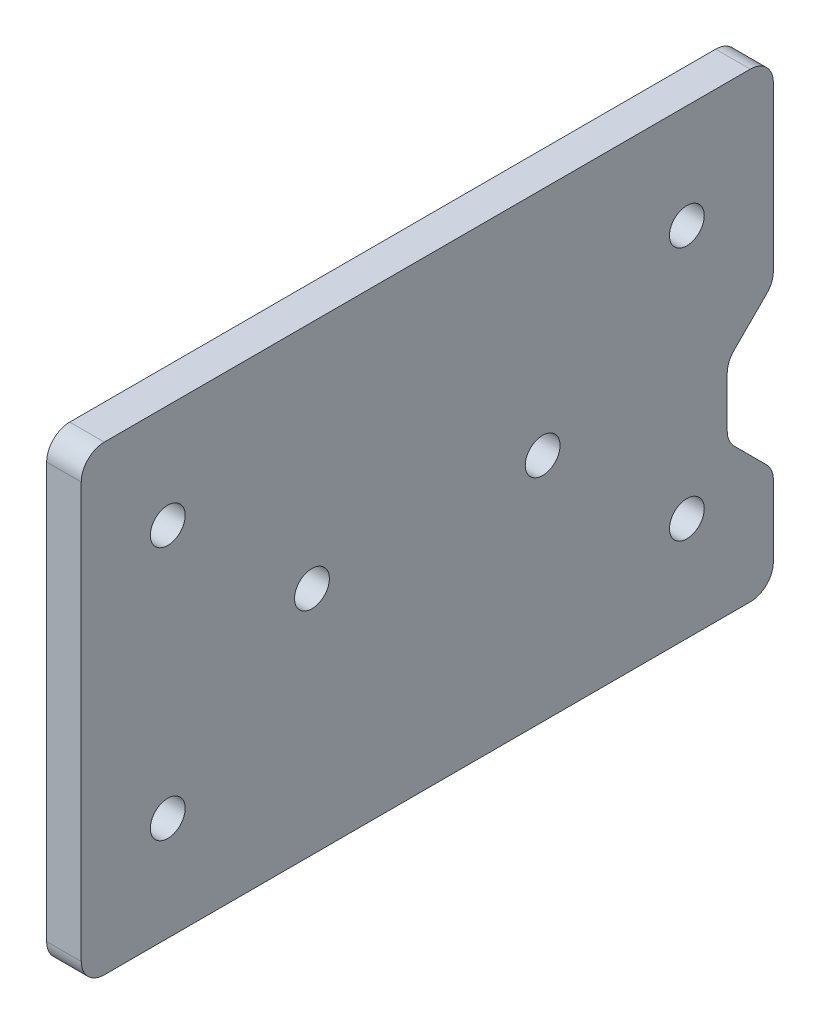
ISO-10303-21;
HEADER;
FILE_DESCRIPTION(('STEP AP214'),'2;1');
FILE_NAME('part.step','',(''),(''),'','','');
FILE_SCHEMA(('AUTOMOTIVE_DESIGN { 1 0 10303 214 1 1 1 1 }'));
ENDSEC;
DATA;
#1=APPLICATION_CONTEXT('core data for automotive mechanical design processes');
#2=APPLICATION_PROTOCOL_DEFINITION('international standard','automotive_design',2000,#1);
#3=PRODUCT_CONTEXT('',#1,'mechanical');
#4=PRODUCT('Part','Part','',(#3));
#5=PRODUCT_RELATED_PRODUCT_CATEGORY('part','',(#4));
#6=PRODUCT_DEFINITION_FORMATION('','',#4);
#7=PRODUCT_DEFINITION_CONTEXT('part definition',#1,'design');
#8=PRODUCT_DEFINITION('design','',#6,#7);
#9=PRODUCT_DEFINITION_SHAPE('','',#8);
#10=(LENGTH_UNIT() NAMED_UNIT(*) SI_UNIT(.MILLI.,.METRE.));
#11=(NAMED_UNIT(*) PLANE_ANGLE_UNIT() SI_UNIT($,.RADIAN.));
#12=(NAMED_UNIT(*) SI_UNIT($,.STERADIAN.) SOLID_ANGLE_UNIT());
#13=UNCERTAINTY_MEASURE_WITH_UNIT(LENGTH_MEASURE(1.E-05),#10,'distance_accuracy_value','');
#14=(GEOMETRIC_REPRESENTATION_CONTEXT(3) GLOBAL_UNCERTAINTY_ASSIGNED_CONTEXT((#13)) GLOBAL_UNIT_ASSIGNED_CONTEXT((#10,
#11,#12)) REPRESENTATION_CONTEXT('',''));
#15=CARTESIAN_POINT('',(0.,0.,0.));
#16=DIRECTION('',(0.,0.,1.));
#17=DIRECTION('',(1.,0.,0.));
#18=AXIS2_PLACEMENT_3D('',#15,#16,#17);
#19=CARTESIAN_POINT('',(3.,20.,-30.));
#20=DIRECTION('',(0.,0.,1.));
#21=DIRECTION('',(0.,-1.,0.));
#22=AXIS2_PLACEMENT_3D('',#19,#20,#21);
#23=PLANE('',#22);
#24=DIRECTION('',(0.,1.,0.));
#25=VECTOR('',#24,1.);
#26=CARTESIAN_POINT('',(3.,20.,-30.));
#27=LINE('',#26,#25);
#28=CARTESIAN_POINT('',(3.,3.8284271247462,-30.));
#29=VERTEX_POINT('',#28);
#30=CARTESIAN_POINT('',(3.,18.,-30.));
#31=VERTEX_POINT('',#30);
#32=EDGE_CURVE('E284',#29,#31,#27,.T.);
#33=ORIENTED_EDGE('',*,*,#32,.F.);
#34=DIRECTION('',(1.,0.,0.));
#35=VECTOR('',#34,1.);
#36=CARTESIAN_POINT('',(0.,3.8284271247462,-30.));
#37=LINE('',#36,#35);
#38=CARTESIAN_POINT('',(0.,3.8284271247462,-30.));
#39=VERTEX_POINT('',#38);
#40=EDGE_CURVE('E247',#29,#39,#37,.F.);
#41=ORIENTED_EDGE('',*,*,#40,.T.);
#42=DIRECTION('',(0.,1.,0.));
#43=VECTOR('',#42,1.);
#44=CARTESIAN_POINT('',(0.,20.,-30.));
#45=LINE('',#44,#43);
#46=CARTESIAN_POINT('',(0.,18.,-30.));
#47=VERTEX_POINT('',#46);
#48=EDGE_CURVE('E296',#39,#47,#45,.T.);
#49=ORIENTED_EDGE('',*,*,#48,.T.);
#50=DIRECTION('',(-1.,0.,0.));
#51=VECTOR('',#50,1.);
#52=CARTESIAN_POINT('',(3.,18.,-30.));
#53=LINE('',#52,#51);
#54=EDGE_CURVE('E250',#47,#31,#53,.F.);
#55=ORIENTED_EDGE('',*,*,#54,.T.);
#56=EDGE_LOOP('',(#33,#41,#49,#55));
#57=FACE_BOUND('',#56,.T.);
#58=ADVANCED_FACE('F42',(#57),#23,.F.);
#59=CARTESIAN_POINT('',(3.,-18.,-30.));
#60=VERTEX_POINT('',#59);
#61=CARTESIAN_POINT('',(3.,-11.8284271247462,-30.));
#62=VERTEX_POINT('',#61);
#63=EDGE_CURVE('E308',#60,#62,#27,.T.);
#64=ORIENTED_EDGE('',*,*,#63,.F.);
#65=DIRECTION('',(-1.,0.,0.));
#66=VECTOR('',#65,1.);
#67=CARTESIAN_POINT('',(3.,-18.,-30.));
#68=LINE('',#67,#66);
#69=CARTESIAN_POINT('',(0.,-18.,-30.));
#70=VERTEX_POINT('',#69);
#71=EDGE_CURVE('E204',#60,#70,#68,.T.);
#72=ORIENTED_EDGE('',*,*,#71,.T.);
#73=CARTESIAN_POINT('',(0.,-11.8284271247462,-30.));
#74=VERTEX_POINT('',#73);
#75=EDGE_CURVE('E292',#70,#74,#45,.T.);
#76=ORIENTED_EDGE('',*,*,#75,.T.);
#77=DIRECTION('',(1.,0.,0.));
#78=VECTOR('',#77,1.);
#79=CARTESIAN_POINT('',(3.,-11.8284271247462,-30.));
#80=LINE('',#79,#78);
#81=EDGE_CURVE('E208',#74,#62,#80,.T.);
#82=ORIENTED_EDGE('',*,*,#81,.T.);
#83=EDGE_LOOP('',(#64,#72,#76,#82));
#84=FACE_BOUND('',#83,.T.);
#85=ADVANCED_FACE('F391',(#84),#23,.F.);
#86=CARTESIAN_POINT('',(3.,0.,0.));
#87=DIRECTION('',(1.,0.,0.));
#88=DIRECTION('',(0.,0.,-1.));
#89=AXIS2_PLACEMENT_3D('',#86,#87,#88);
#90=PLANE('',#89);
#91=CARTESIAN_POINT('',(3.,0.,-9.99999999999999));
#92=DIRECTION('',(1.,0.,0.));
#93=DIRECTION('',(0.,0.,-1.));
#94=AXIS2_PLACEMENT_3D('',#91,#92,#93);
#95=CIRCLE('',#94,1.51);
#96=CARTESIAN_POINT('',(3.,0.,-11.51));
#97=VERTEX_POINT('',#96);
#98=EDGE_CURVE('E338',#97,#97,#95,.T.);
#99=ORIENTED_EDGE('',*,*,#98,.F.);
#100=EDGE_LOOP('',(#99));
#101=FACE_BOUND('',#100,.T.);
#102=CARTESIAN_POINT('',(3.,0.,10.));
#103=DIRECTION('',(1.,0.,0.));
#104=DIRECTION('',(0.,0.,-1.));
#105=AXIS2_PLACEMENT_3D('',#102,#103,#104);
#106=CIRCLE('',#105,1.51);
#107=CARTESIAN_POINT('',(3.,0.,8.49));
#108=VERTEX_POINT('',#107);
#109=EDGE_CURVE('E348',#108,#108,#106,.T.);
#110=ORIENTED_EDGE('',*,*,#109,.F.);
#111=EDGE_LOOP('',(#110));
#112=FACE_BOUND('',#111,.T.);
#113=CARTESIAN_POINT('',(3.,11.,-22.5));
#114=DIRECTION('',(1.,0.,0.));
#115=DIRECTION('',(0.,0.,-1.));
#116=AXIS2_PLACEMENT_3D('',#113,#114,#115);
#117=CIRCLE('',#116,1.51);
#118=CARTESIAN_POINT('',(3.,11.,-24.01));
#119=VERTEX_POINT('',#118);
#120=EDGE_CURVE('E312',#119,#119,#117,.T.);
#121=ORIENTED_EDGE('',*,*,#120,.F.);
#122=EDGE_LOOP('',(#121));
#123=FACE_BOUND('',#122,.T.);
#124=CARTESIAN_POINT('',(3.,11.,22.5));
#125=DIRECTION('',(1.,0.,0.));
#126=DIRECTION('',(0.,0.,-1.));
#127=AXIS2_PLACEMENT_3D('',#124,#125,#126);
#128=CIRCLE('',#127,1.51);
#129=CARTESIAN_POINT('',(3.,11.,20.99));
#130=VERTEX_POINT('',#129);
#131=EDGE_CURVE('E316',#130,#130,#128,.T.);
#132=ORIENTED_EDGE('',*,*,#131,.F.);
#133=EDGE_LOOP('',(#132));
#134=FACE_BOUND('',#133,.T.);
#135=CARTESIAN_POINT('',(3.,-11.,22.5));
#136=DIRECTION('',(1.,0.,0.));
#137=DIRECTION('',(0.,0.,-1.));
#138=AXIS2_PLACEMENT_3D('',#135,#136,#137);
#139=CIRCLE('',#138,1.51);
#140=CARTESIAN_POINT('',(3.,-11.,20.99));
#141=VERTEX_POINT('',#140);
#142=EDGE_CURVE('E320',#141,#141,#139,.T.);
#143=ORIENTED_EDGE('',*,*,#142,.F.);
#144=EDGE_LOOP('',(#143));
#145=FACE_BOUND('',#144,.T.);
#146=CARTESIAN_POINT('',(3.,-11.,-22.5));
#147=DIRECTION('',(1.,0.,0.));
#148=DIRECTION('',(0.,0.,-1.));
#149=AXIS2_PLACEMENT_3D('',#146,#147,#148);
#150=CIRCLE('',#149,1.51);
#151=CARTESIAN_POINT('',(3.,-11.,-24.01));
#152=VERTEX_POINT('',#151);
#153=EDGE_CURVE('E324',#152,#152,#150,.T.);
#154=ORIENTED_EDGE('',*,*,#153,.F.);
#155=EDGE_LOOP('',(#154));
#156=FACE_BOUND('',#155,.T.);
#157=DIRECTION('',(0.,0.707106781186546,-0.707106781186549));
#158=VECTOR('',#157,1.);
#159=CARTESIAN_POINT('',(3.,-13.5,-13.4999999999999));
#160=LINE('',#159,#158);
#161=CARTESIAN_POINT('',(3.,-0.414213562373068,-26.5857864376269));
#162=VERTEX_POINT('',#161);
#163=CARTESIAN_POINT('',(3.,2.4142135623731,-29.4142135623731));
#164=VERTEX_POINT('',#163);
#165=EDGE_CURVE('E165',#162,#164,#160,.T.);
#166=ORIENTED_EDGE('',*,*,#165,.T.);
#167=CARTESIAN_POINT('',(3.,3.8284271247462,-28.));
#168=DIRECTION('',(1.,0.,0.));
#169=DIRECTION('',(0.,0.,-1.));
#170=AXIS2_PLACEMENT_3D('',#167,#168,#169);
#171=CIRCLE('',#170,2.);
#172=EDGE_CURVE('E253',#164,#29,#171,.T.);
#173=ORIENTED_EDGE('',*,*,#172,.T.);
#174=ORIENTED_EDGE('',*,*,#32,.T.);
#175=CARTESIAN_POINT('',(3.,18.,-28.));
#176=DIRECTION('',(1.,0.,0.));
#177=DIRECTION('',(0.,0.,-1.));
#178=AXIS2_PLACEMENT_3D('',#175,#176,#177);
#179=CIRCLE('',#178,2.);
#180=CARTESIAN_POINT('',(3.,20.,-28.));
#181=VERTEX_POINT('',#180);
#182=EDGE_CURVE('E256',#31,#181,#179,.T.);
#183=ORIENTED_EDGE('',*,*,#182,.T.);
#184=DIRECTION('',(0.,0.,1.));
#185=VECTOR('',#184,1.);
#186=CARTESIAN_POINT('',(3.,20.,30.));
#187=LINE('',#186,#185);
#188=CARTESIAN_POINT('',(3.,20.,28.));
#189=VERTEX_POINT('',#188);
#190=EDGE_CURVE('E304',#181,#189,#187,.T.);
#191=ORIENTED_EDGE('',*,*,#190,.T.);
#192=CARTESIAN_POINT('',(3.,18.,28.));
#193=DIRECTION('',(1.,0.,0.));
#194=DIRECTION('',(0.,0.,-1.));
#195=AXIS2_PLACEMENT_3D('',#192,#193,#194);
#196=CIRCLE('',#195,2.);
#197=CARTESIAN_POINT('',(3.,18.,30.));
#198=VERTEX_POINT('',#197);
#199=EDGE_CURVE('E259',#189,#198,#196,.T.);
#200=ORIENTED_EDGE('',*,*,#199,.T.);
#201=DIRECTION('',(0.,-1.,0.));
#202=VECTOR('',#201,1.);
#203=CARTESIAN_POINT('',(3.,20.,30.));
#204=LINE('',#203,#202);
#205=CARTESIAN_POINT('',(3.,-18.,30.));
#206=VERTEX_POINT('',#205);
#207=EDGE_CURVE('E300',#198,#206,#204,.T.);
#208=ORIENTED_EDGE('',*,*,#207,.T.);
#209=CARTESIAN_POINT('',(3.,-18.,28.));
#210=DIRECTION('',(1.,0.,0.));
#211=DIRECTION('',(0.,0.,-1.));
#212=AXIS2_PLACEMENT_3D('',#209,#210,#211);
#213=CIRCLE('',#212,2.);
#214=CARTESIAN_POINT('',(3.,-20.,28.));
#215=VERTEX_POINT('',#214);
#216=EDGE_CURVE('E262',#206,#215,#213,.T.);
#217=ORIENTED_EDGE('',*,*,#216,.T.);
#218=DIRECTION('',(0.,0.,-1.));
#219=VECTOR('',#218,1.);
#220=CARTESIAN_POINT('',(3.,-20.,30.));
#221=LINE('',#220,#219);
#222=CARTESIAN_POINT('',(3.,-20.,-28.));
#223=VERTEX_POINT('',#222);
#224=EDGE_CURVE('E279',#215,#223,#221,.T.);
#225=ORIENTED_EDGE('',*,*,#224,.T.);
#226=CARTESIAN_POINT('',(3.,-18.,-28.));
#227=DIRECTION('',(1.,0.,0.));
#228=DIRECTION('',(0.,0.,-1.));
#229=AXIS2_PLACEMENT_3D('',#226,#227,#228);
#230=CIRCLE('',#229,2.);
#231=EDGE_CURVE('E265',#223,#60,#230,.T.);
#232=ORIENTED_EDGE('',*,*,#231,.T.);
#233=ORIENTED_EDGE('',*,*,#63,.T.);
#234=CARTESIAN_POINT('',(3.,-11.8284271247462,-28.));
#235=DIRECTION('',(1.,0.,0.));
#236=DIRECTION('',(0.,0.,-1.));
#237=AXIS2_PLACEMENT_3D('',#234,#235,#236);
#238=CIRCLE('',#237,2.);
#239=CARTESIAN_POINT('',(3.,-10.4142135623731,-29.4142135623731));
#240=VERTEX_POINT('',#239);
#241=EDGE_CURVE('E268',#62,#240,#238,.T.);
#242=ORIENTED_EDGE('',*,*,#241,.T.);
#243=DIRECTION('',(0.,0.707106781186546,0.707106781186549));
#244=VECTOR('',#243,1.);
#245=CARTESIAN_POINT('',(3.,9.49999999999998,-9.49999999999995));
#246=LINE('',#245,#244);
#247=CARTESIAN_POINT('',(3.,-7.58578643762692,-26.5857864376269));
#248=VERTEX_POINT('',#247);
#249=EDGE_CURVE('E357',#240,#248,#246,.T.);
#250=ORIENTED_EDGE('',*,*,#249,.T.);
#251=CARTESIAN_POINT('',(3.,-6.17157287525382,-28.));
#252=DIRECTION('',(1.,0.,0.));
#253=DIRECTION('',(0.,0.,-1.));
#254=AXIS2_PLACEMENT_3D('',#251,#252,#253);
#255=CIRCLE('',#254,2.);
#256=CARTESIAN_POINT('',(3.,-6.17157287525382,-26.));
#257=VERTEX_POINT('',#256);
#258=EDGE_CURVE('E51',#248,#257,#255,.F.);
#259=ORIENTED_EDGE('',*,*,#258,.T.);
#260=DIRECTION('',(0.,1.,0.));
#261=VECTOR('',#260,1.);
#262=CARTESIAN_POINT('',(3.,0.,-26.));
#263=LINE('',#262,#261);
#264=CARTESIAN_POINT('',(3.,-1.82842712474617,-26.));
#265=VERTEX_POINT('',#264);
#266=EDGE_CURVE('E364',#257,#265,#263,.T.);
#267=ORIENTED_EDGE('',*,*,#266,.T.);
#268=CARTESIAN_POINT('',(3.,-1.82842712474617,-28.));
#269=DIRECTION('',(1.,0.,0.));
#270=DIRECTION('',(0.,0.,-1.));
#271=AXIS2_PLACEMENT_3D('',#268,#269,#270);
#272=CIRCLE('',#271,2.);
#273=EDGE_CURVE('E186',#265,#162,#272,.F.);
#274=ORIENTED_EDGE('',*,*,#273,.T.);
#275=EDGE_LOOP('',(#166,#173,#174,#183,#191,#200,#208,#217,#225,#232,#233,#242,#250,#259,#267,#274));
#276=FACE_BOUND('',#275,.T.);
#277=ADVANCED_FACE('F370',(#101,#112,#123,#134,#145,#156,#276),#90,.T.);
#278=CARTESIAN_POINT('',(0.,0.,0.));
#279=DIRECTION('',(1.,0.,0.));
#280=DIRECTION('',(0.,0.,-1.));
#281=AXIS2_PLACEMENT_3D('',#278,#279,#280);
#282=PLANE('',#281);
#283=CARTESIAN_POINT('',(0.,-11.,-22.5));
#284=DIRECTION('',(-1.,0.,0.));
#285=DIRECTION('',(0.,0.,1.));
#286=AXIS2_PLACEMENT_3D('',#283,#284,#285);
#287=CIRCLE('',#286,1.51);
#288=CARTESIAN_POINT('',(0.,-11.,-20.99));
#289=VERTEX_POINT('',#288);
#290=EDGE_CURVE('E328',#289,#289,#287,.T.);
#291=ORIENTED_EDGE('',*,*,#290,.F.);
#292=EDGE_LOOP('',(#291));
#293=FACE_BOUND('',#292,.T.);
#294=CARTESIAN_POINT('',(0.,-11.,22.5));
#295=DIRECTION('',(-1.,0.,0.));
#296=DIRECTION('',(0.,0.,1.));
#297=AXIS2_PLACEMENT_3D('',#294,#295,#296);
#298=CIRCLE('',#297,1.51);
#299=CARTESIAN_POINT('',(0.,-11.,24.01));
#300=VERTEX_POINT('',#299);
#301=EDGE_CURVE('E332',#300,#300,#298,.T.);
#302=ORIENTED_EDGE('',*,*,#301,.F.);
#303=EDGE_LOOP('',(#302));
#304=FACE_BOUND('',#303,.T.);
#305=CARTESIAN_POINT('',(0.,11.,22.5));
#306=DIRECTION('',(-1.,0.,0.));
#307=DIRECTION('',(0.,0.,1.));
#308=AXIS2_PLACEMENT_3D('',#305,#306,#307);
#309=CIRCLE('',#308,1.51);
#310=CARTESIAN_POINT('',(0.,11.,24.01));
#311=VERTEX_POINT('',#310);
#312=EDGE_CURVE('E337',#311,#311,#309,.T.);
#313=ORIENTED_EDGE('',*,*,#312,.F.);
#314=EDGE_LOOP('',(#313));
#315=FACE_BOUND('',#314,.T.);
#316=CARTESIAN_POINT('',(0.,11.,-22.5));
#317=DIRECTION('',(-1.,0.,0.));
#318=DIRECTION('',(0.,0.,1.));
#319=AXIS2_PLACEMENT_3D('',#316,#317,#318);
#320=CIRCLE('',#319,1.51);
#321=CARTESIAN_POINT('',(0.,11.,-20.99));
#322=VERTEX_POINT('',#321);
#323=EDGE_CURVE('E333',#322,#322,#320,.T.);
#324=ORIENTED_EDGE('',*,*,#323,.F.);
#325=EDGE_LOOP('',(#324));
#326=FACE_BOUND('',#325,.T.);
#327=CARTESIAN_POINT('',(0.,0.,10.));
#328=DIRECTION('',(-1.,0.,0.));
#329=DIRECTION('',(0.,0.,1.));
#330=AXIS2_PLACEMENT_3D('',#327,#328,#329);
#331=CIRCLE('',#330,1.51);
#332=CARTESIAN_POINT('',(0.,0.,11.51));
#333=VERTEX_POINT('',#332);
#334=EDGE_CURVE('E353',#333,#333,#331,.T.);
#335=ORIENTED_EDGE('',*,*,#334,.F.);
#336=EDGE_LOOP('',(#335));
#337=FACE_BOUND('',#336,.T.);
#338=CARTESIAN_POINT('',(0.,0.,-9.99999999999999));
#339=DIRECTION('',(-1.,0.,0.));
#340=DIRECTION('',(0.,0.,1.));
#341=AXIS2_PLACEMENT_3D('',#338,#339,#340);
#342=CIRCLE('',#341,1.51);
#343=CARTESIAN_POINT('',(0.,0.,-8.48999999999999));
#344=VERTEX_POINT('',#343);
#345=EDGE_CURVE('E352',#344,#344,#342,.T.);
#346=ORIENTED_EDGE('',*,*,#345,.F.);
#347=EDGE_LOOP('',(#346));
#348=FACE_BOUND('',#347,.T.);
#349=ORIENTED_EDGE('',*,*,#48,.F.);
#350=CARTESIAN_POINT('',(0.,3.8284271247462,-28.));
#351=DIRECTION('',(1.,0.,0.));
#352=DIRECTION('',(0.,0.,-1.));
#353=AXIS2_PLACEMENT_3D('',#350,#351,#352);
#354=CIRCLE('',#353,2.);
#355=CARTESIAN_POINT('',(0.,2.41421356237311,-29.4142135623731));
#356=VERTEX_POINT('',#355);
#357=EDGE_CURVE('E177',#39,#356,#354,.F.);
#358=ORIENTED_EDGE('',*,*,#357,.T.);
#359=DIRECTION('',(0.,0.707106781186546,-0.707106781186549));
#360=VECTOR('',#359,1.);
#361=CARTESIAN_POINT('',(0.,-13.5,-13.4999999999999));
#362=LINE('',#361,#360);
#363=CARTESIAN_POINT('',(0.,-0.41421356237307,-26.5857864376269));
#364=VERTEX_POINT('',#363);
#365=EDGE_CURVE('E162',#364,#356,#362,.T.);
#366=ORIENTED_EDGE('',*,*,#365,.F.);
#367=CARTESIAN_POINT('',(0.,-1.82842712474617,-28.));
#368=DIRECTION('',(1.,0.,0.));
#369=DIRECTION('',(0.,0.,-1.));
#370=AXIS2_PLACEMENT_3D('',#367,#368,#369);
#371=CIRCLE('',#370,2.);
#372=CARTESIAN_POINT('',(0.,-1.82842712474617,-26.));
#373=VERTEX_POINT('',#372);
#374=EDGE_CURVE('E174',#364,#373,#371,.T.);
#375=ORIENTED_EDGE('',*,*,#374,.T.);
#376=DIRECTION('',(0.,1.,0.));
#377=VECTOR('',#376,1.);
#378=CARTESIAN_POINT('',(0.,0.,-26.));
#379=LINE('',#378,#377);
#380=CARTESIAN_POINT('',(0.,-6.17157287525382,-26.));
#381=VERTEX_POINT('',#380);
#382=EDGE_CURVE('E276',#381,#373,#379,.T.);
#383=ORIENTED_EDGE('',*,*,#382,.F.);
#384=CARTESIAN_POINT('',(0.,-6.17157287525382,-28.));
#385=DIRECTION('',(1.,0.,0.));
#386=DIRECTION('',(0.,0.,-1.));
#387=AXIS2_PLACEMENT_3D('',#384,#385,#386);
#388=CIRCLE('',#387,2.);
#389=CARTESIAN_POINT('',(0.,-7.58578643762692,-26.5857864376269));
#390=VERTEX_POINT('',#389);
#391=EDGE_CURVE('E11',#381,#390,#388,.T.);
#392=ORIENTED_EDGE('',*,*,#391,.T.);
#393=DIRECTION('',(0.,0.707106781186546,0.707106781186549));
#394=VECTOR('',#393,1.);
#395=CARTESIAN_POINT('',(0.,9.49999999999998,-9.49999999999995));
#396=LINE('',#395,#394);
#397=CARTESIAN_POINT('',(0.,-10.4142135623731,-29.4142135623731));
#398=VERTEX_POINT('',#397);
#399=EDGE_CURVE('E179',#398,#390,#396,.T.);
#400=ORIENTED_EDGE('',*,*,#399,.F.);
#401=CARTESIAN_POINT('',(0.,-11.8284271247462,-28.));
#402=DIRECTION('',(1.,0.,0.));
#403=DIRECTION('',(0.,0.,-1.));
#404=AXIS2_PLACEMENT_3D('',#401,#402,#403);
#405=CIRCLE('',#404,2.);
#406=EDGE_CURVE('E244',#398,#74,#405,.F.);
#407=ORIENTED_EDGE('',*,*,#406,.T.);
#408=ORIENTED_EDGE('',*,*,#75,.F.);
#409=CARTESIAN_POINT('',(0.,-18.,-28.));
#410=DIRECTION('',(1.,0.,0.));
#411=DIRECTION('',(0.,0.,-1.));
#412=AXIS2_PLACEMENT_3D('',#409,#410,#411);
#413=CIRCLE('',#412,2.);
#414=CARTESIAN_POINT('',(0.,-20.,-28.));
#415=VERTEX_POINT('',#414);
#416=EDGE_CURVE('E241',#70,#415,#413,.F.);
#417=ORIENTED_EDGE('',*,*,#416,.T.);
#418=DIRECTION('',(0.,0.,-1.));
#419=VECTOR('',#418,1.);
#420=CARTESIAN_POINT('',(0.,-20.,30.));
#421=LINE('',#420,#419);
#422=CARTESIAN_POINT('',(0.,-20.,28.));
#423=VERTEX_POINT('',#422);
#424=EDGE_CURVE('E280',#423,#415,#421,.T.);
#425=ORIENTED_EDGE('',*,*,#424,.F.);
#426=CARTESIAN_POINT('',(0.,-18.,28.));
#427=DIRECTION('',(1.,0.,0.));
#428=DIRECTION('',(0.,0.,-1.));
#429=AXIS2_PLACEMENT_3D('',#426,#427,#428);
#430=CIRCLE('',#429,2.);
#431=CARTESIAN_POINT('',(0.,-18.,30.));
#432=VERTEX_POINT('',#431);
#433=EDGE_CURVE('E238',#423,#432,#430,.F.);
#434=ORIENTED_EDGE('',*,*,#433,.T.);
#435=DIRECTION('',(0.,-1.,0.));
#436=VECTOR('',#435,1.);
#437=CARTESIAN_POINT('',(0.,20.,30.));
#438=LINE('',#437,#436);
#439=CARTESIAN_POINT('',(0.,18.,30.));
#440=VERTEX_POINT('',#439);
#441=EDGE_CURVE('E285',#440,#432,#438,.T.);
#442=ORIENTED_EDGE('',*,*,#441,.F.);
#443=CARTESIAN_POINT('',(0.,18.,28.));
#444=DIRECTION('',(1.,0.,0.));
#445=DIRECTION('',(0.,0.,-1.));
#446=AXIS2_PLACEMENT_3D('',#443,#444,#445);
#447=CIRCLE('',#446,2.);
#448=CARTESIAN_POINT('',(0.,20.,28.));
#449=VERTEX_POINT('',#448);
#450=EDGE_CURVE('E58',#440,#449,#447,.F.);
#451=ORIENTED_EDGE('',*,*,#450,.T.);
#452=DIRECTION('',(0.,0.,1.));
#453=VECTOR('',#452,1.);
#454=CARTESIAN_POINT('',(0.,20.,30.));
#455=LINE('',#454,#453);
#456=CARTESIAN_POINT('',(0.,20.,-28.));
#457=VERTEX_POINT('',#456);
#458=EDGE_CURVE('E289',#457,#449,#455,.T.);
#459=ORIENTED_EDGE('',*,*,#458,.F.);
#460=CARTESIAN_POINT('',(0.,18.,-28.));
#461=DIRECTION('',(1.,0.,0.));
#462=DIRECTION('',(0.,0.,-1.));
#463=AXIS2_PLACEMENT_3D('',#460,#461,#462);
#464=CIRCLE('',#463,2.);
#465=EDGE_CURVE('E66',#457,#47,#464,.F.);
#466=ORIENTED_EDGE('',*,*,#465,.T.);
#467=EDGE_LOOP('',(#349,#358,#366,#375,#383,#392,#400,#407,#408,#417,#425,#434,#442,#451,#459,#466));
#468=FACE_BOUND('',#467,.T.);
#469=ADVANCED_FACE('F172',(#293,#304,#315,#326,#337,#348,#468),#282,.F.);
#470=CARTESIAN_POINT('',(3.,20.,30.));
#471=DIRECTION('',(0.,-1.,0.));
#472=DIRECTION('',(0.,0.,-1.));
#473=AXIS2_PLACEMENT_3D('',#470,#471,#472);
#474=PLANE('',#473);
#475=ORIENTED_EDGE('',*,*,#190,.F.);
#476=DIRECTION('',(-1.,0.,0.));
#477=VECTOR('',#476,1.);
#478=CARTESIAN_POINT('',(3.,20.,-28.));
#479=LINE('',#478,#477);
#480=EDGE_CURVE('E226',#181,#457,#479,.T.);
#481=ORIENTED_EDGE('',*,*,#480,.T.);
#482=ORIENTED_EDGE('',*,*,#458,.T.);
#483=DIRECTION('',(-1.,0.,0.));
#484=VECTOR('',#483,1.);
#485=CARTESIAN_POINT('',(3.,20.,28.));
#486=LINE('',#485,#484);
#487=EDGE_CURVE('E229',#449,#189,#486,.F.);
#488=ORIENTED_EDGE('',*,*,#487,.T.);
#489=EDGE_LOOP('',(#475,#481,#482,#488));
#490=FACE_BOUND('',#489,.T.);
#491=ADVANCED_FACE('F417',(#490),#474,.F.);
#492=CARTESIAN_POINT('',(3.,20.,30.));
#493=DIRECTION('',(0.,0.,-1.));
#494=DIRECTION('',(0.,1.,0.));
#495=AXIS2_PLACEMENT_3D('',#492,#493,#494);
#496=PLANE('',#495);
#497=ORIENTED_EDGE('',*,*,#207,.F.);
#498=DIRECTION('',(-1.,0.,0.));
#499=VECTOR('',#498,1.);
#500=CARTESIAN_POINT('',(3.,18.,30.));
#501=LINE('',#500,#499);
#502=EDGE_CURVE('E219',#198,#440,#501,.T.);
#503=ORIENTED_EDGE('',*,*,#502,.T.);
#504=ORIENTED_EDGE('',*,*,#441,.T.);
#505=DIRECTION('',(-1.,0.,0.));
#506=VECTOR('',#505,1.);
#507=CARTESIAN_POINT('',(3.,-18.,30.));
#508=LINE('',#507,#506);
#509=EDGE_CURVE('E223',#432,#206,#508,.F.);
#510=ORIENTED_EDGE('',*,*,#509,.T.);
#511=EDGE_LOOP('',(#497,#503,#504,#510));
#512=FACE_BOUND('',#511,.T.);
#513=ADVANCED_FACE('F409',(#512),#496,.F.);
#514=CARTESIAN_POINT('',(3.,-20.,30.));
#515=DIRECTION('',(0.,1.,0.));
#516=DIRECTION('',(0.,0.,1.));
#517=AXIS2_PLACEMENT_3D('',#514,#515,#516);
#518=PLANE('',#517);
#519=ORIENTED_EDGE('',*,*,#224,.F.);
#520=DIRECTION('',(-1.,0.,0.));
#521=VECTOR('',#520,1.);
#522=CARTESIAN_POINT('',(3.,-20.,28.));
#523=LINE('',#522,#521);
#524=EDGE_CURVE('E212',#215,#423,#523,.T.);
#525=ORIENTED_EDGE('',*,*,#524,.T.);
#526=ORIENTED_EDGE('',*,*,#424,.T.);
#527=DIRECTION('',(-1.,0.,0.));
#528=VECTOR('',#527,1.);
#529=CARTESIAN_POINT('',(3.,-20.,-28.));
#530=LINE('',#529,#528);
#531=EDGE_CURVE('E216',#415,#223,#530,.F.);
#532=ORIENTED_EDGE('',*,*,#531,.T.);
#533=EDGE_LOOP('',(#519,#525,#526,#532));
#534=FACE_BOUND('',#533,.T.);
#535=ADVANCED_FACE('F399',(#534),#518,.F.);
#536=CARTESIAN_POINT('',(10.,-11.,-22.5));
#537=DIRECTION('',(-1.,0.,0.));
#538=DIRECTION('',(0.,0.,1.));
#539=AXIS2_PLACEMENT_3D('',#536,#537,#538);
#540=CYLINDRICAL_SURFACE('',#539,1.51);
#541=ORIENTED_EDGE('',*,*,#153,.T.);
#542=EDGE_LOOP('',(#541));
#543=FACE_BOUND('',#542,.T.);
#544=ORIENTED_EDGE('',*,*,#290,.T.);
#545=EDGE_LOOP('',(#544));
#546=FACE_BOUND('',#545,.T.);
#547=ADVANCED_FACE('F448',(#543,#546),#540,.F.);
#548=CARTESIAN_POINT('',(10.,-11.,22.5));
#549=DIRECTION('',(-1.,0.,0.));
#550=DIRECTION('',(0.,0.,1.));
#551=AXIS2_PLACEMENT_3D('',#548,#549,#550);
#552=CYLINDRICAL_SURFACE('',#551,1.51);
#553=ORIENTED_EDGE('',*,*,#142,.T.);
#554=EDGE_LOOP('',(#553));
#555=FACE_BOUND('',#554,.T.);
#556=ORIENTED_EDGE('',*,*,#301,.T.);
#557=EDGE_LOOP('',(#556));
#558=FACE_BOUND('',#557,.T.);
#559=ADVANCED_FACE('F457',(#555,#558),#552,.F.);
#560=CARTESIAN_POINT('',(10.,11.,22.5));
#561=DIRECTION('',(-1.,0.,0.));
#562=DIRECTION('',(0.,0.,1.));
#563=AXIS2_PLACEMENT_3D('',#560,#561,#562);
#564=CYLINDRICAL_SURFACE('',#563,1.51);
#565=ORIENTED_EDGE('',*,*,#131,.T.);
#566=EDGE_LOOP('',(#565));
#567=FACE_BOUND('',#566,.T.);
#568=ORIENTED_EDGE('',*,*,#312,.T.);
#569=EDGE_LOOP('',(#568));
#570=FACE_BOUND('',#569,.T.);
#571=ADVANCED_FACE('F463',(#567,#570),#564,.F.);
#572=CARTESIAN_POINT('',(10.,11.,-22.5));
#573=DIRECTION('',(-1.,0.,0.));
#574=DIRECTION('',(0.,0.,1.));
#575=AXIS2_PLACEMENT_3D('',#572,#573,#574);
#576=CYLINDRICAL_SURFACE('',#575,1.51);
#577=ORIENTED_EDGE('',*,*,#120,.T.);
#578=EDGE_LOOP('',(#577));
#579=FACE_BOUND('',#578,.T.);
#580=ORIENTED_EDGE('',*,*,#323,.T.);
#581=EDGE_LOOP('',(#580));
#582=FACE_BOUND('',#581,.T.);
#583=ADVANCED_FACE('F459',(#579,#582),#576,.F.);
#584=CARTESIAN_POINT('',(10.,0.,10.));
#585=DIRECTION('',(-1.,0.,0.));
#586=DIRECTION('',(0.,0.,1.));
#587=AXIS2_PLACEMENT_3D('',#584,#585,#586);
#588=CYLINDRICAL_SURFACE('',#587,1.51);
#589=ORIENTED_EDGE('',*,*,#109,.T.);
#590=EDGE_LOOP('',(#589));
#591=FACE_BOUND('',#590,.T.);
#592=ORIENTED_EDGE('',*,*,#334,.T.);
#593=EDGE_LOOP('',(#592));
#594=FACE_BOUND('',#593,.T.);
#595=ADVANCED_FACE('F462',(#591,#594),#588,.F.);
#596=CARTESIAN_POINT('',(10.,0.,-9.99999999999999));
#597=DIRECTION('',(-1.,0.,0.));
#598=DIRECTION('',(0.,0.,1.));
#599=AXIS2_PLACEMENT_3D('',#596,#597,#598);
#600=CYLINDRICAL_SURFACE('',#599,1.51);
#601=ORIENTED_EDGE('',*,*,#98,.T.);
#602=EDGE_LOOP('',(#601));
#603=FACE_BOUND('',#602,.T.);
#604=ORIENTED_EDGE('',*,*,#345,.T.);
#605=EDGE_LOOP('',(#604));
#606=FACE_BOUND('',#605,.T.);
#607=ADVANCED_FACE('F473',(#603,#606),#600,.F.);
#608=CARTESIAN_POINT('',(-7.,-13.5,-13.4999999999999));
#609=DIRECTION('',(0.,-0.707106781186549,-0.707106781186546));
#610=DIRECTION('',(0.,0.707106781186546,-0.707106781186549));
#611=AXIS2_PLACEMENT_3D('',#608,#609,#610);
#612=PLANE('',#611);
#613=ORIENTED_EDGE('',*,*,#365,.T.);
#614=DIRECTION('',(1.,0.,0.));
#615=VECTOR('',#614,1.);
#616=CARTESIAN_POINT('',(3.,2.4142135623731,-29.4142135623731));
#617=LINE('',#616,#615);
#618=EDGE_CURVE('E169',#356,#164,#617,.T.);
#619=ORIENTED_EDGE('',*,*,#618,.T.);
#620=ORIENTED_EDGE('',*,*,#165,.F.);
#621=DIRECTION('',(1.,0.,0.));
#622=VECTOR('',#621,1.);
#623=CARTESIAN_POINT('',(0.,-0.414213562373071,-26.5857864376269));
#624=LINE('',#623,#622);
#625=EDGE_CURVE('E158',#162,#364,#624,.F.);
#626=ORIENTED_EDGE('',*,*,#625,.T.);
#627=EDGE_LOOP('',(#613,#619,#620,#626));
#628=FACE_BOUND('',#627,.T.);
#629=ADVANCED_FACE('F160',(#628),#612,.T.);
#630=CARTESIAN_POINT('',(-7.,9.49999999999998,-9.49999999999995));
#631=DIRECTION('',(0.,0.707106781186549,-0.707106781186546));
#632=DIRECTION('',(0.,0.707106781186546,0.707106781186549));
#633=AXIS2_PLACEMENT_3D('',#630,#631,#632);
#634=PLANE('',#633);
#635=ORIENTED_EDGE('',*,*,#249,.F.);
#636=DIRECTION('',(1.,0.,0.));
#637=VECTOR('',#636,1.);
#638=CARTESIAN_POINT('',(0.,-10.4142135623731,-29.4142135623731));
#639=LINE('',#638,#637);
#640=EDGE_CURVE('E197',#240,#398,#639,.F.);
#641=ORIENTED_EDGE('',*,*,#640,.T.);
#642=ORIENTED_EDGE('',*,*,#399,.T.);
#643=DIRECTION('',(1.,0.,0.));
#644=VECTOR('',#643,1.);
#645=CARTESIAN_POINT('',(3.,-7.58578643762691,-26.5857864376269));
#646=LINE('',#645,#644);
#647=EDGE_CURVE('E200',#390,#248,#646,.T.);
#648=ORIENTED_EDGE('',*,*,#647,.T.);
#649=EDGE_LOOP('',(#635,#641,#642,#648));
#650=FACE_BOUND('',#649,.T.);
#651=ADVANCED_FACE('F383',(#650),#634,.T.);
#652=CARTESIAN_POINT('',(-7.,0.,-26.));
#653=DIRECTION('',(0.,0.,-1.));
#654=DIRECTION('',(-1.,0.,0.));
#655=AXIS2_PLACEMENT_3D('',#652,#653,#654);
#656=PLANE('',#655);
#657=ORIENTED_EDGE('',*,*,#382,.T.);
#658=DIRECTION('',(1.,0.,0.));
#659=VECTOR('',#658,1.);
#660=CARTESIAN_POINT('',(3.,-1.82842712474617,-26.));
#661=LINE('',#660,#659);
#662=EDGE_CURVE('E184',#373,#265,#661,.T.);
#663=ORIENTED_EDGE('',*,*,#662,.T.);
#664=ORIENTED_EDGE('',*,*,#266,.F.);
#665=DIRECTION('',(1.,0.,0.));
#666=VECTOR('',#665,1.);
#667=CARTESIAN_POINT('',(0.,-6.17157287525382,-26.));
#668=LINE('',#667,#666);
#669=EDGE_CURVE('E194',#257,#381,#668,.F.);
#670=ORIENTED_EDGE('',*,*,#669,.T.);
#671=EDGE_LOOP('',(#657,#663,#664,#670));
#672=FACE_BOUND('',#671,.T.);
#673=ADVANCED_FACE('F375',(#672),#656,.T.);
#674=CARTESIAN_POINT('',(-7.,3.8284271247462,-28.));
#675=DIRECTION('',(-1.,0.,0.));
#676=DIRECTION('',(0.,0.,1.));
#677=AXIS2_PLACEMENT_3D('',#674,#675,#676);
#678=CYLINDRICAL_SURFACE('',#677,2.);
#679=ORIENTED_EDGE('',*,*,#357,.F.);
#680=ORIENTED_EDGE('',*,*,#40,.F.);
#681=ORIENTED_EDGE('',*,*,#172,.F.);
#682=ORIENTED_EDGE('',*,*,#618,.F.);
#683=EDGE_LOOP('',(#679,#680,#681,#682));
#684=FACE_BOUND('',#683,.T.);
#685=ADVANCED_FACE('F426',(#684),#678,.T.);
#686=CARTESIAN_POINT('',(3.,18.,-28.));
#687=DIRECTION('',(-1.,0.,0.));
#688=DIRECTION('',(0.,0.,1.));
#689=AXIS2_PLACEMENT_3D('',#686,#687,#688);
#690=CYLINDRICAL_SURFACE('',#689,2.);
#691=ORIENTED_EDGE('',*,*,#182,.F.);
#692=ORIENTED_EDGE('',*,*,#54,.F.);
#693=ORIENTED_EDGE('',*,*,#465,.F.);
#694=ORIENTED_EDGE('',*,*,#480,.F.);
#695=EDGE_LOOP('',(#691,#692,#693,#694));
#696=FACE_BOUND('',#695,.T.);
#697=ADVANCED_FACE('F419',(#696),#690,.T.);
#698=CARTESIAN_POINT('',(3.,18.,28.));
#699=DIRECTION('',(-1.,0.,0.));
#700=DIRECTION('',(0.,0.,1.));
#701=AXIS2_PLACEMENT_3D('',#698,#699,#700);
#702=CYLINDRICAL_SURFACE('',#701,2.);
#703=ORIENTED_EDGE('',*,*,#199,.F.);
#704=ORIENTED_EDGE('',*,*,#487,.F.);
#705=ORIENTED_EDGE('',*,*,#450,.F.);
#706=ORIENTED_EDGE('',*,*,#502,.F.);
#707=EDGE_LOOP('',(#703,#704,#705,#706));
#708=FACE_BOUND('',#707,.T.);
#709=ADVANCED_FACE('F413',(#708),#702,.T.);
#710=CARTESIAN_POINT('',(3.,-18.,28.));
#711=DIRECTION('',(-1.,0.,0.));
#712=DIRECTION('',(0.,0.,1.));
#713=AXIS2_PLACEMENT_3D('',#710,#711,#712);
#714=CYLINDRICAL_SURFACE('',#713,2.);
#715=ORIENTED_EDGE('',*,*,#216,.F.);
#716=ORIENTED_EDGE('',*,*,#509,.F.);
#717=ORIENTED_EDGE('',*,*,#433,.F.);
#718=ORIENTED_EDGE('',*,*,#524,.F.);
#719=EDGE_LOOP('',(#715,#716,#717,#718));
#720=FACE_BOUND('',#719,.T.);
#721=ADVANCED_FACE('F405',(#720),#714,.T.);
#722=CARTESIAN_POINT('',(3.,-18.,-28.));
#723=DIRECTION('',(-1.,0.,0.));
#724=DIRECTION('',(0.,0.,1.));
#725=AXIS2_PLACEMENT_3D('',#722,#723,#724);
#726=CYLINDRICAL_SURFACE('',#725,2.);
#727=ORIENTED_EDGE('',*,*,#231,.F.);
#728=ORIENTED_EDGE('',*,*,#531,.F.);
#729=ORIENTED_EDGE('',*,*,#416,.F.);
#730=ORIENTED_EDGE('',*,*,#71,.F.);
#731=EDGE_LOOP('',(#727,#728,#729,#730));
#732=FACE_BOUND('',#731,.T.);
#733=ADVANCED_FACE('F402',(#732),#726,.T.);
#734=CARTESIAN_POINT('',(3.,-11.8284271247462,-28.));
#735=DIRECTION('',(-1.,0.,0.));
#736=DIRECTION('',(0.,0.,1.));
#737=AXIS2_PLACEMENT_3D('',#734,#735,#736);
#738=CYLINDRICAL_SURFACE('',#737,2.);
#739=ORIENTED_EDGE('',*,*,#406,.F.);
#740=ORIENTED_EDGE('',*,*,#640,.F.);
#741=ORIENTED_EDGE('',*,*,#241,.F.);
#742=ORIENTED_EDGE('',*,*,#81,.F.);
#743=EDGE_LOOP('',(#739,#740,#741,#742));
#744=FACE_BOUND('',#743,.T.);
#745=ADVANCED_FACE('F389',(#744),#738,.T.);
#746=CARTESIAN_POINT('',(-7.,-1.82842712474617,-28.));
#747=DIRECTION('',(-1.,0.,0.));
#748=DIRECTION('',(0.,0.,1.));
#749=AXIS2_PLACEMENT_3D('',#746,#747,#748);
#750=CYLINDRICAL_SURFACE('',#749,2.);
#751=ORIENTED_EDGE('',*,*,#374,.F.);
#752=ORIENTED_EDGE('',*,*,#625,.F.);
#753=ORIENTED_EDGE('',*,*,#273,.F.);
#754=ORIENTED_EDGE('',*,*,#662,.F.);
#755=EDGE_LOOP('',(#751,#752,#753,#754));
#756=FACE_BOUND('',#755,.T.);
#757=ADVANCED_FACE('F182',(#756),#750,.F.);
#758=CARTESIAN_POINT('',(-7.,-6.17157287525382,-28.));
#759=DIRECTION('',(-1.,0.,0.));
#760=DIRECTION('',(0.,0.,1.));
#761=AXIS2_PLACEMENT_3D('',#758,#759,#760);
#762=CYLINDRICAL_SURFACE('',#761,2.);
#763=ORIENTED_EDGE('',*,*,#391,.F.);
#764=ORIENTED_EDGE('',*,*,#669,.F.);
#765=ORIENTED_EDGE('',*,*,#258,.F.);
#766=ORIENTED_EDGE('',*,*,#647,.F.);
#767=EDGE_LOOP('',(#763,#764,#765,#766));
#768=FACE_BOUND('',#767,.T.);
#769=ADVANCED_FACE('F44',(#768),#762,.F.);
#770=CLOSED_SHELL('',(#58,#85,#277,#469,#491,#513,#535,#547,#559,#571,#583,#595,#607,#629,#651,
#673,#685,#697,#709,#721,#733,#745,#757,#769));
#771=MANIFOLD_SOLID_BREP('B2',#770);
#772=ADVANCED_BREP_SHAPE_REPRESENTATION('',(#18,#771),#14);
#773=SHAPE_DEFINITION_REPRESENTATION(#9,#772);
ENDSEC;
END-ISO-10303-21;
